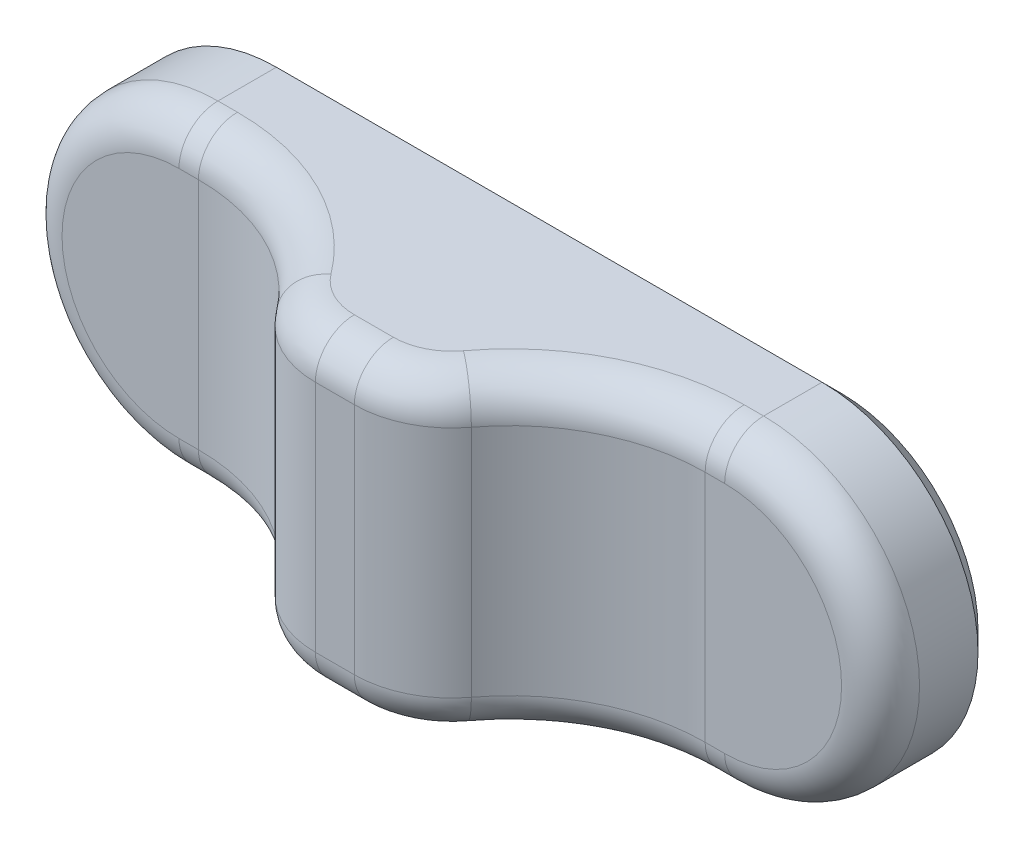
ISO-10303-21;
HEADER;
FILE_DESCRIPTION(('STEP AP214'),'2;1');
FILE_NAME('part.step','',(''),(''),'','','');
FILE_SCHEMA(('AUTOMOTIVE_DESIGN { 1 0 10303 214 1 1 1 1 }'));
ENDSEC;
DATA;
#1=APPLICATION_CONTEXT('core data for automotive mechanical design processes');
#2=APPLICATION_PROTOCOL_DEFINITION('international standard','automotive_design',2000,#1);
#3=PRODUCT_CONTEXT('',#1,'mechanical');
#4=PRODUCT('Part','Part','',(#3));
#5=PRODUCT_RELATED_PRODUCT_CATEGORY('part','',(#4));
#6=PRODUCT_DEFINITION_FORMATION('','',#4);
#7=PRODUCT_DEFINITION_CONTEXT('part definition',#1,'design');
#8=PRODUCT_DEFINITION('design','',#6,#7);
#9=PRODUCT_DEFINITION_SHAPE('','',#8);
#10=(LENGTH_UNIT() NAMED_UNIT(*) SI_UNIT(.MILLI.,.METRE.));
#11=(NAMED_UNIT(*) PLANE_ANGLE_UNIT() SI_UNIT($,.RADIAN.));
#12=(NAMED_UNIT(*) SI_UNIT($,.STERADIAN.) SOLID_ANGLE_UNIT());
#13=UNCERTAINTY_MEASURE_WITH_UNIT(LENGTH_MEASURE(1.E-05),#10,'distance_accuracy_value','');
#14=(GEOMETRIC_REPRESENTATION_CONTEXT(3) GLOBAL_UNCERTAINTY_ASSIGNED_CONTEXT((#13)) GLOBAL_UNIT_ASSIGNED_CONTEXT((#10,
#11,#12)) REPRESENTATION_CONTEXT('',''));
#15=CARTESIAN_POINT('',(0.,0.,0.));
#16=DIRECTION('',(0.,0.,1.));
#17=DIRECTION('',(1.,0.,0.));
#18=AXIS2_PLACEMENT_3D('',#15,#16,#17);
#19=CARTESIAN_POINT('',(5.47499999999995,-89.5,6.));
#20=DIRECTION('',(0.,0.,-1.));
#21=DIRECTION('',(-1.,0.,0.));
#22=AXIS2_PLACEMENT_3D('',#19,#20,#21);
#23=CYLINDRICAL_SURFACE('',#22,4.);
#24=DIRECTION('',(0.,0.,-1.));
#25=VECTOR('',#24,1.);
#26=CARTESIAN_POINT('',(5.47499999999995,-93.5,6.));
#27=LINE('',#26,#25);
#28=CARTESIAN_POINT('',(5.47499999999995,-93.5,2.));
#29=VERTEX_POINT('',#28);
#30=CARTESIAN_POINT('',(5.47499999999995,-93.5,0.500000000000004));
#31=VERTEX_POINT('',#30);
#32=EDGE_CURVE('E239',#29,#31,#27,.T.);
#33=ORIENTED_EDGE('',*,*,#32,.T.);
#34=CARTESIAN_POINT('',(5.47499999999995,-89.5,0.500000000000004));
#35=DIRECTION('',(0.,0.,1.));
#36=DIRECTION('',(1.,0.,0.));
#37=AXIS2_PLACEMENT_3D('',#34,#35,#36);
#38=CIRCLE('',#37,4.);
#39=CARTESIAN_POINT('',(5.47499999999995,-85.5,0.500000000000004));
#40=VERTEX_POINT('',#39);
#41=EDGE_CURVE('E398',#31,#40,#38,.T.);
#42=ORIENTED_EDGE('',*,*,#41,.T.);
#43=DIRECTION('',(0.,0.,-1.));
#44=VECTOR('',#43,1.);
#45=CARTESIAN_POINT('',(5.47499999999995,-85.5,6.));
#46=LINE('',#45,#44);
#47=CARTESIAN_POINT('',(5.47499999999995,-85.5,2.));
#48=VERTEX_POINT('',#47);
#49=EDGE_CURVE('E250',#48,#40,#46,.T.);
#50=ORIENTED_EDGE('',*,*,#49,.F.);
#51=CARTESIAN_POINT('',(5.47499999999995,-89.5,2.));
#52=DIRECTION('',(0.,0.,-1.));
#53=DIRECTION('',(-1.,0.,0.));
#54=AXIS2_PLACEMENT_3D('',#51,#52,#53);
#55=CIRCLE('',#54,4.);
#56=EDGE_CURVE('E319',#48,#29,#55,.T.);
#57=ORIENTED_EDGE('',*,*,#56,.T.);
#58=EDGE_LOOP('',(#33,#42,#50,#57));
#59=FACE_BOUND('',#58,.T.);
#60=ADVANCED_FACE('F40',(#59),#23,.T.);
#61=CARTESIAN_POINT('',(5.47499999999995,-85.5,6.));
#62=DIRECTION('',(0.,-1.,0.));
#63=DIRECTION('',(0.,0.,-1.));
#64=AXIS2_PLACEMENT_3D('',#61,#62,#63);
#65=PLANE('',#64);
#66=ORIENTED_EDGE('',*,*,#49,.T.);
#67=DIRECTION('',(-1.,0.,0.));
#68=VECTOR('',#67,1.);
#69=CARTESIAN_POINT('',(5.47499999999995,-85.5,0.500000000000004));
#70=LINE('',#69,#68);
#71=CARTESIAN_POINT('',(-8.52500000000005,-85.5,0.500000000000004));
#72=VERTEX_POINT('',#71);
#73=EDGE_CURVE('E337',#40,#72,#70,.T.);
#74=ORIENTED_EDGE('',*,*,#73,.T.);
#75=DIRECTION('',(0.,0.,-1.));
#76=VECTOR('',#75,1.);
#77=CARTESIAN_POINT('',(-8.52500000000005,-85.5,6.));
#78=LINE('',#77,#76);
#79=CARTESIAN_POINT('',(-8.52500000000005,-85.5,2.));
#80=VERTEX_POINT('',#79);
#81=EDGE_CURVE('E247',#80,#72,#78,.T.);
#82=ORIENTED_EDGE('',*,*,#81,.F.);
#83=DIRECTION('',(1.,0.,0.));
#84=VECTOR('',#83,1.);
#85=CARTESIAN_POINT('',(5.47499999999995,-85.5,2.));
#86=LINE('',#85,#84);
#87=CARTESIAN_POINT('',(-8.02500000000005,-85.5,2.));
#88=VERTEX_POINT('',#87);
#89=EDGE_CURVE('E321',#80,#88,#86,.T.);
#90=ORIENTED_EDGE('',*,*,#89,.T.);
#91=CARTESIAN_POINT('',(-8.02500000000005,-85.5,8.));
#92=DIRECTION('',(0.,-1.,0.));
#93=DIRECTION('',(0.,0.,-1.));
#94=AXIS2_PLACEMENT_3D('',#91,#92,#93);
#95=CIRCLE('',#94,6.);
#96=CARTESIAN_POINT('',(-3.22500000000005,-85.5,4.4));
#97=VERTEX_POINT('',#96);
#98=EDGE_CURVE('E323',#88,#97,#95,.T.);
#99=ORIENTED_EDGE('',*,*,#98,.T.);
#100=CARTESIAN_POINT('',(-2.02500000000005,-85.5,3.5));
#101=DIRECTION('',(0.,-1.,0.));
#102=DIRECTION('',(0.,0.,-1.));
#103=AXIS2_PLACEMENT_3D('',#100,#101,#102);
#104=CIRCLE('',#103,1.5);
#105=CARTESIAN_POINT('',(-2.02500000000005,-85.5,5.));
#106=VERTEX_POINT('',#105);
#107=EDGE_CURVE('E325',#97,#106,#104,.F.);
#108=ORIENTED_EDGE('',*,*,#107,.T.);
#109=DIRECTION('',(-1.,0.,0.));
#110=VECTOR('',#109,1.);
#111=CARTESIAN_POINT('',(-1.02500000000005,-85.5,5.));
#112=LINE('',#111,#110);
#113=CARTESIAN_POINT('',(-1.02500000000005,-85.5,5.));
#114=VERTEX_POINT('',#113);
#115=EDGE_CURVE('E327',#106,#114,#112,.F.);
#116=ORIENTED_EDGE('',*,*,#115,.T.);
#117=CARTESIAN_POINT('',(-1.02500000000005,-85.5,3.5));
#118=DIRECTION('',(0.,-1.,0.));
#119=DIRECTION('',(0.,0.,-1.));
#120=AXIS2_PLACEMENT_3D('',#117,#118,#119);
#121=CIRCLE('',#120,1.5);
#122=CARTESIAN_POINT('',(0.174999999999951,-85.5,4.4));
#123=VERTEX_POINT('',#122);
#124=EDGE_CURVE('E329',#114,#123,#121,.F.);
#125=ORIENTED_EDGE('',*,*,#124,.T.);
#126=CARTESIAN_POINT('',(4.97499999999995,-85.5,8.));
#127=DIRECTION('',(0.,-1.,0.));
#128=DIRECTION('',(0.,0.,-1.));
#129=AXIS2_PLACEMENT_3D('',#126,#127,#128);
#130=CIRCLE('',#129,6.);
#131=CARTESIAN_POINT('',(4.97499999999995,-85.5,2.));
#132=VERTEX_POINT('',#131);
#133=EDGE_CURVE('E331',#123,#132,#130,.T.);
#134=ORIENTED_EDGE('',*,*,#133,.T.);
#135=DIRECTION('',(1.,0.,0.));
#136=VECTOR('',#135,1.);
#137=CARTESIAN_POINT('',(5.47499999999995,-85.5,2.));
#138=LINE('',#137,#136);
#139=EDGE_CURVE('E333',#132,#48,#138,.T.);
#140=ORIENTED_EDGE('',*,*,#139,.T.);
#141=EDGE_LOOP('',(#66,#74,#82,#90,#99,#108,#116,#125,#134,#140));
#142=FACE_BOUND('',#141,.T.);
#143=ADVANCED_FACE('F468',(#142),#65,.F.);
#144=CARTESIAN_POINT('',(-8.52500000000005,-89.5,6.));
#145=DIRECTION('',(0.,0.,-1.));
#146=DIRECTION('',(-1.,0.,0.));
#147=AXIS2_PLACEMENT_3D('',#144,#145,#146);
#148=CYLINDRICAL_SURFACE('',#147,4.);
#149=ORIENTED_EDGE('',*,*,#81,.T.);
#150=CARTESIAN_POINT('',(-8.52500000000005,-89.5,0.500000000000004));
#151=DIRECTION('',(0.,0.,1.));
#152=DIRECTION('',(1.,0.,0.));
#153=AXIS2_PLACEMENT_3D('',#150,#151,#152);
#154=CIRCLE('',#153,4.);
#155=CARTESIAN_POINT('',(-8.52500000000005,-93.5,0.500000000000004));
#156=VERTEX_POINT('',#155);
#157=EDGE_CURVE('E396',#72,#156,#154,.T.);
#158=ORIENTED_EDGE('',*,*,#157,.T.);
#159=DIRECTION('',(0.,0.,-1.));
#160=VECTOR('',#159,1.);
#161=CARTESIAN_POINT('',(-8.52500000000005,-93.5,6.));
#162=LINE('',#161,#160);
#163=CARTESIAN_POINT('',(-8.52500000000005,-93.5,2.));
#164=VERTEX_POINT('',#163);
#165=EDGE_CURVE('E244',#164,#156,#162,.T.);
#166=ORIENTED_EDGE('',*,*,#165,.F.);
#167=CARTESIAN_POINT('',(-8.52500000000005,-89.5,2.));
#168=DIRECTION('',(0.,0.,-1.));
#169=DIRECTION('',(-1.,0.,0.));
#170=AXIS2_PLACEMENT_3D('',#167,#168,#169);
#171=CIRCLE('',#170,4.);
#172=EDGE_CURVE('E335',#164,#80,#171,.T.);
#173=ORIENTED_EDGE('',*,*,#172,.T.);
#174=EDGE_LOOP('',(#149,#158,#166,#173));
#175=FACE_BOUND('',#174,.T.);
#176=ADVANCED_FACE('F474',(#175),#148,.T.);
#177=CARTESIAN_POINT('',(5.47499999999995,-93.5,6.));
#178=DIRECTION('',(0.,1.,0.));
#179=DIRECTION('',(0.,0.,1.));
#180=AXIS2_PLACEMENT_3D('',#177,#178,#179);
#181=PLANE('',#180);
#182=ORIENTED_EDGE('',*,*,#165,.T.);
#183=DIRECTION('',(1.,0.,0.));
#184=VECTOR('',#183,1.);
#185=CARTESIAN_POINT('',(5.47499999999995,-93.5,0.500000000000004));
#186=LINE('',#185,#184);
#187=EDGE_CURVE('E400',#156,#31,#186,.T.);
#188=ORIENTED_EDGE('',*,*,#187,.T.);
#189=ORIENTED_EDGE('',*,*,#32,.F.);
#190=DIRECTION('',(1.,0.,0.));
#191=VECTOR('',#190,1.);
#192=CARTESIAN_POINT('',(5.47499999999995,-93.5,2.));
#193=LINE('',#192,#191);
#194=CARTESIAN_POINT('',(4.97499999999995,-93.5,2.));
#195=VERTEX_POINT('',#194);
#196=EDGE_CURVE('E278',#29,#195,#193,.F.);
#197=ORIENTED_EDGE('',*,*,#196,.T.);
#198=CARTESIAN_POINT('',(4.97499999999995,-93.5,8.));
#199=DIRECTION('',(0.,1.,0.));
#200=DIRECTION('',(0.,0.,1.));
#201=AXIS2_PLACEMENT_3D('',#198,#199,#200);
#202=CIRCLE('',#201,6.);
#203=CARTESIAN_POINT('',(0.174999999999951,-93.5,4.4));
#204=VERTEX_POINT('',#203);
#205=EDGE_CURVE('E280',#195,#204,#202,.T.);
#206=ORIENTED_EDGE('',*,*,#205,.T.);
#207=CARTESIAN_POINT('',(-1.02500000000005,-93.5,3.5));
#208=DIRECTION('',(0.,1.,0.));
#209=DIRECTION('',(0.,0.,1.));
#210=AXIS2_PLACEMENT_3D('',#207,#208,#209);
#211=CIRCLE('',#210,1.5);
#212=CARTESIAN_POINT('',(-1.02500000000005,-93.5,5.));
#213=VERTEX_POINT('',#212);
#214=EDGE_CURVE('E282',#204,#213,#211,.F.);
#215=ORIENTED_EDGE('',*,*,#214,.T.);
#216=DIRECTION('',(1.,0.,0.));
#217=VECTOR('',#216,1.);
#218=CARTESIAN_POINT('',(-2.02500000000005,-93.5,5.));
#219=LINE('',#218,#217);
#220=CARTESIAN_POINT('',(-2.02500000000005,-93.5,5.));
#221=VERTEX_POINT('',#220);
#222=EDGE_CURVE('E284',#213,#221,#219,.F.);
#223=ORIENTED_EDGE('',*,*,#222,.T.);
#224=CARTESIAN_POINT('',(-2.02500000000005,-93.5,3.5));
#225=DIRECTION('',(0.,1.,0.));
#226=DIRECTION('',(0.,0.,1.));
#227=AXIS2_PLACEMENT_3D('',#224,#225,#226);
#228=CIRCLE('',#227,1.5);
#229=CARTESIAN_POINT('',(-3.22500000000005,-93.5,4.4));
#230=VERTEX_POINT('',#229);
#231=EDGE_CURVE('E286',#221,#230,#228,.F.);
#232=ORIENTED_EDGE('',*,*,#231,.T.);
#233=CARTESIAN_POINT('',(-8.02500000000005,-93.5,8.));
#234=DIRECTION('',(0.,1.,0.));
#235=DIRECTION('',(0.,0.,1.));
#236=AXIS2_PLACEMENT_3D('',#233,#234,#235);
#237=CIRCLE('',#236,6.);
#238=CARTESIAN_POINT('',(-8.02500000000005,-93.5,2.));
#239=VERTEX_POINT('',#238);
#240=EDGE_CURVE('E288',#230,#239,#237,.T.);
#241=ORIENTED_EDGE('',*,*,#240,.T.);
#242=DIRECTION('',(1.,0.,0.));
#243=VECTOR('',#242,1.);
#244=CARTESIAN_POINT('',(5.47499999999995,-93.5,2.));
#245=LINE('',#244,#243);
#246=EDGE_CURVE('E290',#239,#164,#245,.F.);
#247=ORIENTED_EDGE('',*,*,#246,.T.);
#248=EDGE_LOOP('',(#182,#188,#189,#197,#206,#215,#223,#232,#241,#247));
#249=FACE_BOUND('',#248,.T.);
#250=ADVANCED_FACE('F735',(#249),#181,.F.);
#251=CARTESIAN_POINT('',(5.47499999999995,-89.5,6.));
#252=DIRECTION('',(0.,0.,1.));
#253=DIRECTION('',(1.,0.,0.));
#254=AXIS2_PLACEMENT_3D('',#251,#252,#253);
#255=PLANE('',#254);
#256=DIRECTION('',(0.,-1.,0.));
#257=VECTOR('',#256,1.);
#258=CARTESIAN_POINT('',(-2.02500000000005,-93.5,6.));
#259=LINE('',#258,#257);
#260=CARTESIAN_POINT('',(-2.02500000000005,-86.5,6.));
#261=VERTEX_POINT('',#260);
#262=CARTESIAN_POINT('',(-2.02500000000005,-92.5,6.));
#263=VERTEX_POINT('',#262);
#264=EDGE_CURVE('E253',#261,#263,#259,.T.);
#265=ORIENTED_EDGE('',*,*,#264,.T.);
#266=DIRECTION('',(1.,0.,0.));
#267=VECTOR('',#266,1.);
#268=CARTESIAN_POINT('',(-1.02500000000005,-92.5,6.));
#269=LINE('',#268,#267);
#270=CARTESIAN_POINT('',(-1.02500000000005,-92.5,6.));
#271=VERTEX_POINT('',#270);
#272=EDGE_CURVE('E303',#263,#271,#269,.T.);
#273=ORIENTED_EDGE('',*,*,#272,.T.);
#274=DIRECTION('',(0.,-1.,0.));
#275=VECTOR('',#274,1.);
#276=CARTESIAN_POINT('',(-1.02500000000005,-85.5,6.));
#277=LINE('',#276,#275);
#278=CARTESIAN_POINT('',(-1.02500000000005,-86.5,6.));
#279=VERTEX_POINT('',#278);
#280=EDGE_CURVE('E256',#271,#279,#277,.F.);
#281=ORIENTED_EDGE('',*,*,#280,.T.);
#282=DIRECTION('',(-1.,0.,0.));
#283=VECTOR('',#282,1.);
#284=CARTESIAN_POINT('',(-2.02500000000005,-86.5,6.));
#285=LINE('',#284,#283);
#286=EDGE_CURVE('E301',#279,#261,#285,.T.);
#287=ORIENTED_EDGE('',*,*,#286,.T.);
#288=EDGE_LOOP('',(#265,#273,#281,#287));
#289=FACE_BOUND('',#288,.T.);
#290=ADVANCED_FACE('F731',(#289),#255,.T.);
#291=CARTESIAN_POINT('',(5.47499999999995,-89.5,0.));
#292=DIRECTION('',(0.,0.,1.));
#293=DIRECTION('',(1.,0.,0.));
#294=AXIS2_PLACEMENT_3D('',#291,#292,#293);
#295=PLANE('',#294);
#296=CARTESIAN_POINT('',(-8.52500000000005,-89.5,0.));
#297=DIRECTION('',(0.,0.,1.));
#298=DIRECTION('',(1.,0.,0.));
#299=AXIS2_PLACEMENT_3D('',#296,#297,#298);
#300=CIRCLE('',#299,3.5);
#301=CARTESIAN_POINT('',(-8.52500000000005,-93.,0.));
#302=VERTEX_POINT('',#301);
#303=CARTESIAN_POINT('',(-8.52500000000005,-86.,0.));
#304=VERTEX_POINT('',#303);
#305=EDGE_CURVE('E391',#302,#304,#300,.F.);
#306=ORIENTED_EDGE('',*,*,#305,.T.);
#307=DIRECTION('',(1.,0.,0.));
#308=VECTOR('',#307,1.);
#309=CARTESIAN_POINT('',(5.47499999999995,-86.,0.));
#310=LINE('',#309,#308);
#311=CARTESIAN_POINT('',(5.47499999999995,-86.,0.));
#312=VERTEX_POINT('',#311);
#313=EDGE_CURVE('E393',#304,#312,#310,.T.);
#314=ORIENTED_EDGE('',*,*,#313,.T.);
#315=CARTESIAN_POINT('',(5.47499999999995,-89.5,0.));
#316=DIRECTION('',(0.,0.,1.));
#317=DIRECTION('',(1.,0.,0.));
#318=AXIS2_PLACEMENT_3D('',#315,#316,#317);
#319=CIRCLE('',#318,3.5);
#320=CARTESIAN_POINT('',(5.47499999999995,-93.,0.));
#321=VERTEX_POINT('',#320);
#322=EDGE_CURVE('E389',#312,#321,#319,.F.);
#323=ORIENTED_EDGE('',*,*,#322,.T.);
#324=DIRECTION('',(-1.,0.,0.));
#325=VECTOR('',#324,1.);
#326=CARTESIAN_POINT('',(5.47499999999995,-93.,0.));
#327=LINE('',#326,#325);
#328=EDGE_CURVE('E387',#321,#302,#327,.T.);
#329=ORIENTED_EDGE('',*,*,#328,.T.);
#330=EDGE_LOOP('',(#306,#314,#323,#329));
#331=FACE_BOUND('',#330,.T.);
#332=DIRECTION('',(-1.,0.,0.));
#333=VECTOR('',#332,1.);
#334=CARTESIAN_POINT('',(0.0749999999999479,-91.1,0.));
#335=LINE('',#334,#333);
#336=CARTESIAN_POINT('',(0.0749999999999484,-91.1,0.));
#337=VERTEX_POINT('',#336);
#338=CARTESIAN_POINT('',(-3.12500000000005,-91.1,0.));
#339=VERTEX_POINT('',#338);
#340=EDGE_CURVE('E223',#337,#339,#335,.T.);
#341=ORIENTED_EDGE('',*,*,#340,.F.);
#342=DIRECTION('',(0.,-1.,0.));
#343=VECTOR('',#342,1.);
#344=CARTESIAN_POINT('',(0.0749999999999513,-87.9,0.));
#345=LINE('',#344,#343);
#346=CARTESIAN_POINT('',(0.0749999999999513,-87.9,0.));
#347=VERTEX_POINT('',#346);
#348=EDGE_CURVE('E228',#347,#337,#345,.T.);
#349=ORIENTED_EDGE('',*,*,#348,.F.);
#350=DIRECTION('',(1.,0.,0.));
#351=VECTOR('',#350,1.);
#352=CARTESIAN_POINT('',(0.0749999999999513,-87.9,0.));
#353=LINE('',#352,#351);
#354=CARTESIAN_POINT('',(-3.12500000000005,-87.9,0.));
#355=VERTEX_POINT('',#354);
#356=EDGE_CURVE('E232',#355,#347,#353,.T.);
#357=ORIENTED_EDGE('',*,*,#356,.F.);
#358=DIRECTION('',(0.,1.,0.));
#359=VECTOR('',#358,1.);
#360=CARTESIAN_POINT('',(-3.12500000000005,-87.9,0.));
#361=LINE('',#360,#359);
#362=EDGE_CURVE('E217',#339,#355,#361,.T.);
#363=ORIENTED_EDGE('',*,*,#362,.F.);
#364=EDGE_LOOP('',(#341,#349,#357,#363));
#365=FACE_BOUND('',#364,.T.);
#366=ADVANCED_FACE('F230',(#331,#365),#295,.F.);
#367=CARTESIAN_POINT('',(9.47499999999996,-85.5,3.));
#368=DIRECTION('',(0.,0.,-1.));
#369=DIRECTION('',(-1.,0.,0.));
#370=AXIS2_PLACEMENT_3D('',#367,#368,#369);
#371=PLANE('',#370);
#372=DIRECTION('',(0.,1.,0.));
#373=VECTOR('',#372,1.);
#374=CARTESIAN_POINT('',(4.97499999999995,-85.5,3.));
#375=LINE('',#374,#373);
#376=CARTESIAN_POINT('',(4.97499999999995,-86.5,3.));
#377=VERTEX_POINT('',#376);
#378=CARTESIAN_POINT('',(4.97499999999995,-92.5,3.));
#379=VERTEX_POINT('',#378);
#380=EDGE_CURVE('E259',#377,#379,#375,.F.);
#381=ORIENTED_EDGE('',*,*,#380,.T.);
#382=DIRECTION('',(1.,0.,0.));
#383=VECTOR('',#382,1.);
#384=CARTESIAN_POINT('',(9.47499999999996,-92.5,3.));
#385=LINE('',#384,#383);
#386=CARTESIAN_POINT('',(5.47499999999995,-92.5,3.));
#387=VERTEX_POINT('',#386);
#388=EDGE_CURVE('E317',#379,#387,#385,.T.);
#389=ORIENTED_EDGE('',*,*,#388,.T.);
#390=CARTESIAN_POINT('',(5.47499999999995,-89.5,3.));
#391=DIRECTION('',(0.,0.,-1.));
#392=DIRECTION('',(-1.,0.,0.));
#393=AXIS2_PLACEMENT_3D('',#390,#391,#392);
#394=CIRCLE('',#393,3.);
#395=CARTESIAN_POINT('',(5.47499999999995,-86.5,3.));
#396=VERTEX_POINT('',#395);
#397=EDGE_CURVE('E315',#387,#396,#394,.F.);
#398=ORIENTED_EDGE('',*,*,#397,.T.);
#399=DIRECTION('',(1.,0.,0.));
#400=VECTOR('',#399,1.);
#401=CARTESIAN_POINT('',(9.47499999999996,-86.5,3.));
#402=LINE('',#401,#400);
#403=EDGE_CURVE('E313',#396,#377,#402,.F.);
#404=ORIENTED_EDGE('',*,*,#403,.T.);
#405=EDGE_LOOP('',(#381,#389,#398,#404));
#406=FACE_BOUND('',#405,.T.);
#407=ADVANCED_FACE('F710',(#406),#371,.F.);
#408=CARTESIAN_POINT('',(-12.5250000000001,-85.5,3.));
#409=DIRECTION('',(0.,0.,-1.));
#410=DIRECTION('',(-1.,0.,0.));
#411=AXIS2_PLACEMENT_3D('',#408,#409,#410);
#412=PLANE('',#411);
#413=CARTESIAN_POINT('',(-8.52500000000005,-89.5,3.));
#414=DIRECTION('',(0.,0.,-1.));
#415=DIRECTION('',(-1.,0.,0.));
#416=AXIS2_PLACEMENT_3D('',#413,#414,#415);
#417=CIRCLE('',#416,3.);
#418=CARTESIAN_POINT('',(-8.52500000000005,-86.5,3.));
#419=VERTEX_POINT('',#418);
#420=CARTESIAN_POINT('',(-8.52500000000005,-92.5,3.));
#421=VERTEX_POINT('',#420);
#422=EDGE_CURVE('E271',#419,#421,#417,.F.);
#423=ORIENTED_EDGE('',*,*,#422,.T.);
#424=DIRECTION('',(1.,0.,0.));
#425=VECTOR('',#424,1.);
#426=CARTESIAN_POINT('',(-12.5250000000001,-92.5,3.));
#427=LINE('',#426,#425);
#428=CARTESIAN_POINT('',(-8.02500000000005,-92.5,3.));
#429=VERTEX_POINT('',#428);
#430=EDGE_CURVE('E275',#421,#429,#427,.T.);
#431=ORIENTED_EDGE('',*,*,#430,.T.);
#432=DIRECTION('',(0.,1.,0.));
#433=VECTOR('',#432,1.);
#434=CARTESIAN_POINT('',(-8.02500000000005,-85.5,3.));
#435=LINE('',#434,#433);
#436=CARTESIAN_POINT('',(-8.02500000000005,-86.5,3.));
#437=VERTEX_POINT('',#436);
#438=EDGE_CURVE('E268',#429,#437,#435,.T.);
#439=ORIENTED_EDGE('',*,*,#438,.T.);
#440=DIRECTION('',(1.,0.,0.));
#441=VECTOR('',#440,1.);
#442=CARTESIAN_POINT('',(-12.5250000000001,-86.5,3.));
#443=LINE('',#442,#441);
#444=EDGE_CURVE('E273',#437,#419,#443,.F.);
#445=ORIENTED_EDGE('',*,*,#444,.T.);
#446=EDGE_LOOP('',(#423,#431,#439,#445));
#447=FACE_BOUND('',#446,.T.);
#448=ADVANCED_FACE('F705',(#447),#412,.F.);
#449=CARTESIAN_POINT('',(0.0749999999999513,-87.9,5.));
#450=DIRECTION('',(1.,0.,0.));
#451=DIRECTION('',(0.,1.,0.));
#452=AXIS2_PLACEMENT_3D('',#449,#450,#451);
#453=PLANE('',#452);
#454=DIRECTION('',(0.,0.,-1.));
#455=VECTOR('',#454,1.);
#456=CARTESIAN_POINT('',(0.0749999999999479,-91.1,5.));
#457=LINE('',#456,#455);
#458=CARTESIAN_POINT('',(0.0749999999999479,-91.1,4.));
#459=VERTEX_POINT('',#458);
#460=EDGE_CURVE('E220',#459,#337,#457,.T.);
#461=ORIENTED_EDGE('',*,*,#460,.F.);
#462=DIRECTION('',(0.,1.,0.));
#463=VECTOR('',#462,1.);
#464=CARTESIAN_POINT('',(0.0749999999999513,-87.9,4.));
#465=LINE('',#464,#463);
#466=CARTESIAN_POINT('',(0.0749999999999513,-87.9,4.));
#467=VERTEX_POINT('',#466);
#468=EDGE_CURVE('E11',#459,#467,#465,.T.);
#469=ORIENTED_EDGE('',*,*,#468,.T.);
#470=DIRECTION('',(0.,0.,-1.));
#471=VECTOR('',#470,1.);
#472=CARTESIAN_POINT('',(0.0749999999999513,-87.9,5.));
#473=LINE('',#472,#471);
#474=EDGE_CURVE('E237',#467,#347,#473,.T.);
#475=ORIENTED_EDGE('',*,*,#474,.T.);
#476=ORIENTED_EDGE('',*,*,#348,.T.);
#477=EDGE_LOOP('',(#461,#469,#475,#476));
#478=FACE_BOUND('',#477,.T.);
#479=ADVANCED_FACE('F446',(#478),#453,.F.);
#480=CARTESIAN_POINT('',(0.0749999999999513,-87.9,5.));
#481=DIRECTION('',(0.,1.,0.));
#482=DIRECTION('',(0.,0.,1.));
#483=AXIS2_PLACEMENT_3D('',#480,#481,#482);
#484=PLANE('',#483);
#485=ORIENTED_EDGE('',*,*,#474,.F.);
#486=DIRECTION('',(-1.,0.,0.));
#487=VECTOR('',#486,1.);
#488=CARTESIAN_POINT('',(0.0749999999999513,-87.9,4.));
#489=LINE('',#488,#487);
#490=CARTESIAN_POINT('',(-3.12500000000005,-87.9,4.));
#491=VERTEX_POINT('',#490);
#492=EDGE_CURVE('E420',#467,#491,#489,.T.);
#493=ORIENTED_EDGE('',*,*,#492,.T.);
#494=DIRECTION('',(0.,0.,-1.));
#495=VECTOR('',#494,1.);
#496=CARTESIAN_POINT('',(-3.12500000000005,-87.9,5.));
#497=LINE('',#496,#495);
#498=EDGE_CURVE('E219',#491,#355,#497,.T.);
#499=ORIENTED_EDGE('',*,*,#498,.T.);
#500=ORIENTED_EDGE('',*,*,#356,.T.);
#501=EDGE_LOOP('',(#485,#493,#499,#500));
#502=FACE_BOUND('',#501,.T.);
#503=ADVANCED_FACE('F449',(#502),#484,.F.);
#504=CARTESIAN_POINT('',(-3.12500000000005,-87.9,5.));
#505=DIRECTION('',(-1.,0.,0.));
#506=DIRECTION('',(0.,0.,1.));
#507=AXIS2_PLACEMENT_3D('',#504,#505,#506);
#508=PLANE('',#507);
#509=ORIENTED_EDGE('',*,*,#498,.F.);
#510=DIRECTION('',(0.,-1.,0.));
#511=VECTOR('',#510,1.);
#512=CARTESIAN_POINT('',(-3.12500000000005,-87.9,4.));
#513=LINE('',#512,#511);
#514=CARTESIAN_POINT('',(-3.12500000000005,-91.1,4.));
#515=VERTEX_POINT('',#514);
#516=EDGE_CURVE('E65',#491,#515,#513,.T.);
#517=ORIENTED_EDGE('',*,*,#516,.T.);
#518=DIRECTION('',(0.,0.,-1.));
#519=VECTOR('',#518,1.);
#520=CARTESIAN_POINT('',(-3.12500000000005,-91.1,5.));
#521=LINE('',#520,#519);
#522=EDGE_CURVE('E213',#515,#339,#521,.T.);
#523=ORIENTED_EDGE('',*,*,#522,.T.);
#524=ORIENTED_EDGE('',*,*,#362,.T.);
#525=EDGE_LOOP('',(#509,#517,#523,#524));
#526=FACE_BOUND('',#525,.T.);
#527=ADVANCED_FACE('F215',(#526),#508,.F.);
#528=CARTESIAN_POINT('',(0.0749999999999479,-91.1,5.));
#529=DIRECTION('',(0.,-1.,0.));
#530=DIRECTION('',(0.,0.,-1.));
#531=AXIS2_PLACEMENT_3D('',#528,#529,#530);
#532=PLANE('',#531);
#533=ORIENTED_EDGE('',*,*,#522,.F.);
#534=DIRECTION('',(1.,0.,0.));
#535=VECTOR('',#534,1.);
#536=CARTESIAN_POINT('',(0.0749999999999479,-91.1,4.));
#537=LINE('',#536,#535);
#538=EDGE_CURVE('E50',#515,#459,#537,.T.);
#539=ORIENTED_EDGE('',*,*,#538,.T.);
#540=ORIENTED_EDGE('',*,*,#460,.T.);
#541=ORIENTED_EDGE('',*,*,#340,.T.);
#542=EDGE_LOOP('',(#533,#539,#540,#541));
#543=FACE_BOUND('',#542,.T.);
#544=ADVANCED_FACE('F224',(#543),#532,.F.);
#545=CARTESIAN_POINT('',(0.,0.,5.));
#546=DIRECTION('',(0.,0.,-1.));
#547=DIRECTION('',(-1.,0.,0.));
#548=AXIS2_PLACEMENT_3D('',#545,#546,#547);
#549=PLANE('',#548);
#550=DIRECTION('',(0.,1.,0.));
#551=VECTOR('',#550,1.);
#552=CARTESIAN_POINT('',(-2.12500000000004,0.,5.));
#553=LINE('',#552,#551);
#554=CARTESIAN_POINT('',(-2.12500000000004,-90.1,5.));
#555=VERTEX_POINT('',#554);
#556=CARTESIAN_POINT('',(-2.12500000000004,-88.9,5.));
#557=VERTEX_POINT('',#556);
#558=EDGE_CURVE('E415',#555,#557,#553,.T.);
#559=ORIENTED_EDGE('',*,*,#558,.T.);
#560=DIRECTION('',(1.,0.,0.));
#561=VECTOR('',#560,1.);
#562=CARTESIAN_POINT('',(0.,-88.9,5.));
#563=LINE('',#562,#561);
#564=CARTESIAN_POINT('',(-0.925000000000058,-88.9,5.));
#565=VERTEX_POINT('',#564);
#566=EDGE_CURVE('E417',#557,#565,#563,.T.);
#567=ORIENTED_EDGE('',*,*,#566,.T.);
#568=DIRECTION('',(0.,-1.,0.));
#569=VECTOR('',#568,1.);
#570=CARTESIAN_POINT('',(-0.924999999999964,0.,5.));
#571=LINE('',#570,#569);
#572=CARTESIAN_POINT('',(-0.925000000000059,-90.1,5.));
#573=VERTEX_POINT('',#572);
#574=EDGE_CURVE('E402',#565,#573,#571,.T.);
#575=ORIENTED_EDGE('',*,*,#574,.T.);
#576=DIRECTION('',(-1.,0.,0.));
#577=VECTOR('',#576,1.);
#578=CARTESIAN_POINT('',(0.,-90.1,5.));
#579=LINE('',#578,#577);
#580=EDGE_CURVE('E413',#573,#555,#579,.T.);
#581=ORIENTED_EDGE('',*,*,#580,.T.);
#582=EDGE_LOOP('',(#559,#567,#575,#581));
#583=FACE_BOUND('',#582,.T.);
#584=ADVANCED_FACE('F454',(#583),#549,.T.);
#585=CARTESIAN_POINT('',(-1.02500000000005,-85.5,3.5));
#586=DIRECTION('',(0.,1.,0.));
#587=DIRECTION('',(0.,0.,1.));
#588=AXIS2_PLACEMENT_3D('',#585,#586,#587);
#589=CYLINDRICAL_SURFACE('',#588,2.5);
#590=ORIENTED_EDGE('',*,*,#280,.F.);
#591=CARTESIAN_POINT('',(-1.02500000000005,-92.5,3.5));
#592=DIRECTION('',(0.,1.,0.));
#593=DIRECTION('',(0.,0.,1.));
#594=AXIS2_PLACEMENT_3D('',#591,#592,#593);
#595=CIRCLE('',#594,2.5);
#596=CARTESIAN_POINT('',(0.974999999999951,-92.5,5.));
#597=VERTEX_POINT('',#596);
#598=EDGE_CURVE('E307',#271,#597,#595,.T.);
#599=ORIENTED_EDGE('',*,*,#598,.T.);
#600=DIRECTION('',(0.,1.,0.));
#601=VECTOR('',#600,1.);
#602=CARTESIAN_POINT('',(0.974999999999951,-85.5,5.));
#603=LINE('',#602,#601);
#604=CARTESIAN_POINT('',(0.974999999999951,-86.5,5.));
#605=VERTEX_POINT('',#604);
#606=EDGE_CURVE('E262',#597,#605,#603,.T.);
#607=ORIENTED_EDGE('',*,*,#606,.T.);
#608=CARTESIAN_POINT('',(-1.02500000000005,-86.5,3.5));
#609=DIRECTION('',(0.,-1.,0.));
#610=DIRECTION('',(0.,0.,-1.));
#611=AXIS2_PLACEMENT_3D('',#608,#609,#610);
#612=CIRCLE('',#611,2.5);
#613=EDGE_CURVE('E305',#605,#279,#612,.T.);
#614=ORIENTED_EDGE('',*,*,#613,.T.);
#615=EDGE_LOOP('',(#590,#599,#607,#614));
#616=FACE_BOUND('',#615,.T.);
#617=ADVANCED_FACE('F456',(#616),#589,.T.);
#618=CARTESIAN_POINT('',(-2.02500000000005,-89.5,3.5));
#619=DIRECTION('',(0.,1.,0.));
#620=DIRECTION('',(0.,0.,1.));
#621=AXIS2_PLACEMENT_3D('',#618,#619,#620);
#622=CYLINDRICAL_SURFACE('',#621,2.5);
#623=DIRECTION('',(0.,1.,0.));
#624=VECTOR('',#623,1.);
#625=CARTESIAN_POINT('',(-4.02500000000005,-89.5,5.));
#626=LINE('',#625,#624);
#627=CARTESIAN_POINT('',(-4.02500000000005,-86.5,5.));
#628=VERTEX_POINT('',#627);
#629=CARTESIAN_POINT('',(-4.02500000000005,-92.5,5.));
#630=VERTEX_POINT('',#629);
#631=EDGE_CURVE('E265',#628,#630,#626,.F.);
#632=ORIENTED_EDGE('',*,*,#631,.T.);
#633=CARTESIAN_POINT('',(-2.02500000000005,-92.5,3.5));
#634=DIRECTION('',(0.,1.,0.));
#635=DIRECTION('',(0.,0.,1.));
#636=AXIS2_PLACEMENT_3D('',#633,#634,#635);
#637=CIRCLE('',#636,2.5);
#638=EDGE_CURVE('E299',#630,#263,#637,.T.);
#639=ORIENTED_EDGE('',*,*,#638,.T.);
#640=ORIENTED_EDGE('',*,*,#264,.F.);
#641=CARTESIAN_POINT('',(-2.02500000000005,-86.5,3.5));
#642=DIRECTION('',(0.,-1.,0.));
#643=DIRECTION('',(0.,0.,-1.));
#644=AXIS2_PLACEMENT_3D('',#641,#642,#643);
#645=CIRCLE('',#644,2.5);
#646=EDGE_CURVE('E297',#261,#628,#645,.T.);
#647=ORIENTED_EDGE('',*,*,#646,.T.);
#648=EDGE_LOOP('',(#632,#639,#640,#647));
#649=FACE_BOUND('',#648,.T.);
#650=ADVANCED_FACE('F462',(#649),#622,.T.);
#651=CARTESIAN_POINT('',(4.97499999999995,-85.5,8.));
#652=DIRECTION('',(0.,1.,0.));
#653=DIRECTION('',(0.,0.,1.));
#654=AXIS2_PLACEMENT_3D('',#651,#652,#653);
#655=CYLINDRICAL_SURFACE('',#654,5.);
#656=ORIENTED_EDGE('',*,*,#606,.F.);
#657=CARTESIAN_POINT('',(4.97499999999995,-92.5,8.));
#658=DIRECTION('',(0.,1.,0.));
#659=DIRECTION('',(0.,0.,1.));
#660=AXIS2_PLACEMENT_3D('',#657,#658,#659);
#661=CIRCLE('',#660,5.);
#662=EDGE_CURVE('E311',#597,#379,#661,.F.);
#663=ORIENTED_EDGE('',*,*,#662,.T.);
#664=ORIENTED_EDGE('',*,*,#380,.F.);
#665=CARTESIAN_POINT('',(4.97499999999995,-86.5,8.));
#666=DIRECTION('',(0.,-1.,0.));
#667=DIRECTION('',(0.,0.,-1.));
#668=AXIS2_PLACEMENT_3D('',#665,#666,#667);
#669=CIRCLE('',#668,5.);
#670=EDGE_CURVE('E309',#377,#605,#669,.F.);
#671=ORIENTED_EDGE('',*,*,#670,.T.);
#672=EDGE_LOOP('',(#656,#663,#664,#671));
#673=FACE_BOUND('',#672,.T.);
#674=ADVANCED_FACE('F481',(#673),#655,.F.);
#675=CARTESIAN_POINT('',(-8.02500000000005,-89.5,8.));
#676=DIRECTION('',(0.,1.,0.));
#677=DIRECTION('',(0.,0.,1.));
#678=AXIS2_PLACEMENT_3D('',#675,#676,#677);
#679=CYLINDRICAL_SURFACE('',#678,5.);
#680=ORIENTED_EDGE('',*,*,#438,.F.);
#681=CARTESIAN_POINT('',(-8.02500000000005,-92.5,8.));
#682=DIRECTION('',(0.,1.,0.));
#683=DIRECTION('',(0.,0.,1.));
#684=AXIS2_PLACEMENT_3D('',#681,#682,#683);
#685=CIRCLE('',#684,5.);
#686=EDGE_CURVE('E295',#429,#630,#685,.F.);
#687=ORIENTED_EDGE('',*,*,#686,.T.);
#688=ORIENTED_EDGE('',*,*,#631,.F.);
#689=CARTESIAN_POINT('',(-8.02500000000005,-86.5,8.));
#690=DIRECTION('',(0.,-1.,0.));
#691=DIRECTION('',(0.,0.,-1.));
#692=AXIS2_PLACEMENT_3D('',#689,#690,#691);
#693=CIRCLE('',#692,5.);
#694=EDGE_CURVE('E293',#628,#437,#693,.F.);
#695=ORIENTED_EDGE('',*,*,#694,.T.);
#696=EDGE_LOOP('',(#680,#687,#688,#695));
#697=FACE_BOUND('',#696,.T.);
#698=ADVANCED_FACE('F485',(#697),#679,.F.);
#699=CARTESIAN_POINT('',(5.47499999999995,-86.5,2.));
#700=DIRECTION('',(1.,0.,0.));
#701=DIRECTION('',(0.,0.,-1.));
#702=AXIS2_PLACEMENT_3D('',#699,#700,#701);
#703=CYLINDRICAL_SURFACE('',#702,1.);
#704=CARTESIAN_POINT('',(5.47499999999995,-86.5,2.));
#705=DIRECTION('',(1.,0.,0.));
#706=DIRECTION('',(0.,0.,-1.));
#707=AXIS2_PLACEMENT_3D('',#704,#705,#706);
#708=CIRCLE('',#707,1.);
#709=EDGE_CURVE('E379',#48,#396,#708,.T.);
#710=ORIENTED_EDGE('',*,*,#709,.F.);
#711=ORIENTED_EDGE('',*,*,#139,.F.);
#712=CARTESIAN_POINT('',(4.97499999999995,-86.5,2.));
#713=DIRECTION('',(-1.,0.,0.));
#714=DIRECTION('',(0.,0.,1.));
#715=AXIS2_PLACEMENT_3D('',#712,#713,#714);
#716=CIRCLE('',#715,1.);
#717=EDGE_CURVE('E382',#377,#132,#716,.T.);
#718=ORIENTED_EDGE('',*,*,#717,.F.);
#719=ORIENTED_EDGE('',*,*,#403,.F.);
#720=EDGE_LOOP('',(#710,#711,#718,#719));
#721=FACE_BOUND('',#720,.T.);
#722=ADVANCED_FACE('F489',(#721),#703,.T.);
#723=CARTESIAN_POINT('',(4.97499999999995,-86.5,8.));
#724=DIRECTION('',(0.,-1.,0.));
#725=DIRECTION('',(0.,0.,-1.));
#726=AXIS2_PLACEMENT_3D('',#723,#724,#725);
#727=TOROIDAL_SURFACE('',#726,6.,1.);
#728=ORIENTED_EDGE('',*,*,#717,.T.);
#729=ORIENTED_EDGE('',*,*,#133,.F.);
#730=CARTESIAN_POINT('',(0.174999999999951,-86.5,4.4));
#731=DIRECTION('',(-0.6,0.,0.8));
#732=DIRECTION('',(0.8,0.,0.6));
#733=AXIS2_PLACEMENT_3D('',#730,#731,#732);
#734=CIRCLE('',#733,1.);
#735=EDGE_CURVE('E376',#605,#123,#734,.T.);
#736=ORIENTED_EDGE('',*,*,#735,.F.);
#737=ORIENTED_EDGE('',*,*,#670,.F.);
#738=EDGE_LOOP('',(#728,#729,#736,#737));
#739=FACE_BOUND('',#738,.T.);
#740=ADVANCED_FACE('F547',(#739),#727,.T.);
#741=CARTESIAN_POINT('',(5.47499999999995,-89.5,2.));
#742=DIRECTION('',(0.,0.,-1.));
#743=DIRECTION('',(-1.,0.,0.));
#744=AXIS2_PLACEMENT_3D('',#741,#742,#743);
#745=TOROIDAL_SURFACE('',#744,3.,1.);
#746=ORIENTED_EDGE('',*,*,#709,.T.);
#747=ORIENTED_EDGE('',*,*,#397,.F.);
#748=CARTESIAN_POINT('',(5.47499999999995,-92.5,2.));
#749=DIRECTION('',(-1.,0.,0.));
#750=DIRECTION('',(0.,0.,1.));
#751=AXIS2_PLACEMENT_3D('',#748,#749,#750);
#752=CIRCLE('',#751,1.);
#753=EDGE_CURVE('E373',#29,#387,#752,.T.);
#754=ORIENTED_EDGE('',*,*,#753,.F.);
#755=ORIENTED_EDGE('',*,*,#56,.F.);
#756=EDGE_LOOP('',(#746,#747,#754,#755));
#757=FACE_BOUND('',#756,.T.);
#758=ADVANCED_FACE('F543',(#757),#745,.T.);
#759=CARTESIAN_POINT('',(-1.02500000000005,-86.5,3.5));
#760=DIRECTION('',(0.,-1.,0.));
#761=DIRECTION('',(0.,0.,-1.));
#762=AXIS2_PLACEMENT_3D('',#759,#760,#761);
#763=TOROIDAL_SURFACE('',#762,1.5,1.);
#764=ORIENTED_EDGE('',*,*,#735,.T.);
#765=ORIENTED_EDGE('',*,*,#124,.F.);
#766=CARTESIAN_POINT('',(-1.02500000000005,-86.5,5.));
#767=DIRECTION('',(-1.,0.,0.));
#768=DIRECTION('',(0.,0.,1.));
#769=AXIS2_PLACEMENT_3D('',#766,#767,#768);
#770=CIRCLE('',#769,1.);
#771=EDGE_CURVE('E370',#279,#114,#770,.T.);
#772=ORIENTED_EDGE('',*,*,#771,.F.);
#773=ORIENTED_EDGE('',*,*,#613,.F.);
#774=EDGE_LOOP('',(#764,#765,#772,#773));
#775=FACE_BOUND('',#774,.T.);
#776=ADVANCED_FACE('F539',(#775),#763,.T.);
#777=CARTESIAN_POINT('',(9.47499999999996,-92.5,2.));
#778=DIRECTION('',(1.,0.,0.));
#779=DIRECTION('',(0.,0.,-1.));
#780=AXIS2_PLACEMENT_3D('',#777,#778,#779);
#781=CYLINDRICAL_SURFACE('',#780,1.);
#782=ORIENTED_EDGE('',*,*,#753,.T.);
#783=ORIENTED_EDGE('',*,*,#388,.F.);
#784=CARTESIAN_POINT('',(4.97499999999995,-92.5,2.));
#785=DIRECTION('',(-1.,0.,0.));
#786=DIRECTION('',(0.,0.,1.));
#787=AXIS2_PLACEMENT_3D('',#784,#785,#786);
#788=CIRCLE('',#787,1.);
#789=EDGE_CURVE('E367',#195,#379,#788,.T.);
#790=ORIENTED_EDGE('',*,*,#789,.F.);
#791=ORIENTED_EDGE('',*,*,#196,.F.);
#792=EDGE_LOOP('',(#782,#783,#790,#791));
#793=FACE_BOUND('',#792,.T.);
#794=ADVANCED_FACE('F535',(#793),#781,.T.);
#795=CARTESIAN_POINT('',(5.47499999999995,-86.5,5.));
#796=DIRECTION('',(1.,0.,0.));
#797=DIRECTION('',(0.,0.,-1.));
#798=AXIS2_PLACEMENT_3D('',#795,#796,#797);
#799=CYLINDRICAL_SURFACE('',#798,1.);
#800=ORIENTED_EDGE('',*,*,#771,.T.);
#801=ORIENTED_EDGE('',*,*,#115,.F.);
#802=CARTESIAN_POINT('',(-2.02500000000005,-86.5,5.));
#803=DIRECTION('',(-1.,0.,0.));
#804=DIRECTION('',(0.,0.,1.));
#805=AXIS2_PLACEMENT_3D('',#802,#803,#804);
#806=CIRCLE('',#805,1.);
#807=EDGE_CURVE('E364',#261,#106,#806,.T.);
#808=ORIENTED_EDGE('',*,*,#807,.F.);
#809=ORIENTED_EDGE('',*,*,#286,.F.);
#810=EDGE_LOOP('',(#800,#801,#808,#809));
#811=FACE_BOUND('',#810,.T.);
#812=ADVANCED_FACE('F531',(#811),#799,.T.);
#813=CARTESIAN_POINT('',(4.97499999999995,-92.5,8.));
#814=DIRECTION('',(0.,1.,0.));
#815=DIRECTION('',(0.,0.,1.));
#816=AXIS2_PLACEMENT_3D('',#813,#814,#815);
#817=TOROIDAL_SURFACE('',#816,6.,1.);
#818=ORIENTED_EDGE('',*,*,#789,.T.);
#819=ORIENTED_EDGE('',*,*,#662,.F.);
#820=CARTESIAN_POINT('',(0.174999999999951,-92.5,4.4));
#821=DIRECTION('',(-0.6,0.,0.8));
#822=DIRECTION('',(0.8,0.,0.6));
#823=AXIS2_PLACEMENT_3D('',#820,#821,#822);
#824=CIRCLE('',#823,1.);
#825=EDGE_CURVE('E361',#204,#597,#824,.T.);
#826=ORIENTED_EDGE('',*,*,#825,.F.);
#827=ORIENTED_EDGE('',*,*,#205,.F.);
#828=EDGE_LOOP('',(#818,#819,#826,#827));
#829=FACE_BOUND('',#828,.T.);
#830=ADVANCED_FACE('F527',(#829),#817,.T.);
#831=CARTESIAN_POINT('',(-2.02500000000005,-86.5,3.5));
#832=DIRECTION('',(0.,-1.,0.));
#833=DIRECTION('',(0.,0.,-1.));
#834=AXIS2_PLACEMENT_3D('',#831,#832,#833);
#835=TOROIDAL_SURFACE('',#834,1.5,1.);
#836=ORIENTED_EDGE('',*,*,#807,.T.);
#837=ORIENTED_EDGE('',*,*,#107,.F.);
#838=CARTESIAN_POINT('',(-3.22500000000005,-86.5,4.4));
#839=DIRECTION('',(-0.6,0.,-0.8));
#840=DIRECTION('',(-0.8,0.,0.6));
#841=AXIS2_PLACEMENT_3D('',#838,#839,#840);
#842=CIRCLE('',#841,1.);
#843=EDGE_CURVE('E358',#628,#97,#842,.T.);
#844=ORIENTED_EDGE('',*,*,#843,.F.);
#845=ORIENTED_EDGE('',*,*,#646,.F.);
#846=EDGE_LOOP('',(#836,#837,#844,#845));
#847=FACE_BOUND('',#846,.T.);
#848=ADVANCED_FACE('F523',(#847),#835,.T.);
#849=CARTESIAN_POINT('',(-1.02500000000005,-92.5,3.5));
#850=DIRECTION('',(0.,1.,0.));
#851=DIRECTION('',(0.,0.,1.));
#852=AXIS2_PLACEMENT_3D('',#849,#850,#851);
#853=TOROIDAL_SURFACE('',#852,1.5,1.);
#854=ORIENTED_EDGE('',*,*,#825,.T.);
#855=ORIENTED_EDGE('',*,*,#598,.F.);
#856=CARTESIAN_POINT('',(-1.02500000000005,-92.5,5.));
#857=DIRECTION('',(-1.,0.,0.));
#858=DIRECTION('',(0.,0.,1.));
#859=AXIS2_PLACEMENT_3D('',#856,#857,#858);
#860=CIRCLE('',#859,1.);
#861=EDGE_CURVE('E355',#213,#271,#860,.T.);
#862=ORIENTED_EDGE('',*,*,#861,.F.);
#863=ORIENTED_EDGE('',*,*,#214,.F.);
#864=EDGE_LOOP('',(#854,#855,#862,#863));
#865=FACE_BOUND('',#864,.T.);
#866=ADVANCED_FACE('F519',(#865),#853,.T.);
#867=CARTESIAN_POINT('',(-8.02500000000005,-86.5,8.));
#868=DIRECTION('',(0.,-1.,0.));
#869=DIRECTION('',(0.,0.,-1.));
#870=AXIS2_PLACEMENT_3D('',#867,#868,#869);
#871=TOROIDAL_SURFACE('',#870,6.,1.);
#872=ORIENTED_EDGE('',*,*,#843,.T.);
#873=ORIENTED_EDGE('',*,*,#98,.F.);
#874=CARTESIAN_POINT('',(-8.02500000000005,-86.5,2.));
#875=DIRECTION('',(-1.,0.,0.));
#876=DIRECTION('',(0.,0.,1.));
#877=AXIS2_PLACEMENT_3D('',#874,#875,#876);
#878=CIRCLE('',#877,1.);
#879=EDGE_CURVE('E352',#437,#88,#878,.T.);
#880=ORIENTED_EDGE('',*,*,#879,.F.);
#881=ORIENTED_EDGE('',*,*,#694,.F.);
#882=EDGE_LOOP('',(#872,#873,#880,#881));
#883=FACE_BOUND('',#882,.T.);
#884=ADVANCED_FACE('F515',(#883),#871,.T.);
#885=CARTESIAN_POINT('',(5.47499999999995,-92.5,5.));
#886=DIRECTION('',(-1.,0.,0.));
#887=DIRECTION('',(0.,0.,1.));
#888=AXIS2_PLACEMENT_3D('',#885,#886,#887);
#889=CYLINDRICAL_SURFACE('',#888,1.);
#890=ORIENTED_EDGE('',*,*,#861,.T.);
#891=ORIENTED_EDGE('',*,*,#272,.F.);
#892=CARTESIAN_POINT('',(-2.02500000000005,-92.5,5.));
#893=DIRECTION('',(-1.,0.,0.));
#894=DIRECTION('',(0.,0.,1.));
#895=AXIS2_PLACEMENT_3D('',#892,#893,#894);
#896=CIRCLE('',#895,1.);
#897=EDGE_CURVE('E349',#221,#263,#896,.T.);
#898=ORIENTED_EDGE('',*,*,#897,.F.);
#899=ORIENTED_EDGE('',*,*,#222,.F.);
#900=EDGE_LOOP('',(#890,#891,#898,#899));
#901=FACE_BOUND('',#900,.T.);
#902=ADVANCED_FACE('F511',(#901),#889,.T.);
#903=CARTESIAN_POINT('',(5.47499999999995,-86.5,2.));
#904=DIRECTION('',(1.,0.,0.));
#905=DIRECTION('',(0.,0.,-1.));
#906=AXIS2_PLACEMENT_3D('',#903,#904,#905);
#907=CYLINDRICAL_SURFACE('',#906,1.);
#908=ORIENTED_EDGE('',*,*,#879,.T.);
#909=ORIENTED_EDGE('',*,*,#89,.F.);
#910=CARTESIAN_POINT('',(-8.52500000000005,-86.5,2.));
#911=DIRECTION('',(-1.,0.,0.));
#912=DIRECTION('',(0.,0.,1.));
#913=AXIS2_PLACEMENT_3D('',#910,#911,#912);
#914=CIRCLE('',#913,1.);
#915=EDGE_CURVE('E346',#419,#80,#914,.T.);
#916=ORIENTED_EDGE('',*,*,#915,.F.);
#917=ORIENTED_EDGE('',*,*,#444,.F.);
#918=EDGE_LOOP('',(#908,#909,#916,#917));
#919=FACE_BOUND('',#918,.T.);
#920=ADVANCED_FACE('F507',(#919),#907,.T.);
#921=CARTESIAN_POINT('',(-2.02500000000005,-92.5,3.5));
#922=DIRECTION('',(0.,1.,0.));
#923=DIRECTION('',(0.,0.,1.));
#924=AXIS2_PLACEMENT_3D('',#921,#922,#923);
#925=TOROIDAL_SURFACE('',#924,1.5,1.);
#926=ORIENTED_EDGE('',*,*,#897,.T.);
#927=ORIENTED_EDGE('',*,*,#638,.F.);
#928=CARTESIAN_POINT('',(-3.22500000000005,-92.5,4.4));
#929=DIRECTION('',(-0.6,0.,-0.8));
#930=DIRECTION('',(-0.8,0.,0.6));
#931=AXIS2_PLACEMENT_3D('',#928,#929,#930);
#932=CIRCLE('',#931,1.);
#933=EDGE_CURVE('E343',#230,#630,#932,.T.);
#934=ORIENTED_EDGE('',*,*,#933,.F.);
#935=ORIENTED_EDGE('',*,*,#231,.F.);
#936=EDGE_LOOP('',(#926,#927,#934,#935));
#937=FACE_BOUND('',#936,.T.);
#938=ADVANCED_FACE('F503',(#937),#925,.T.);
#939=CARTESIAN_POINT('',(-8.52500000000005,-89.5,2.));
#940=DIRECTION('',(0.,0.,-1.));
#941=DIRECTION('',(-1.,0.,0.));
#942=AXIS2_PLACEMENT_3D('',#939,#940,#941);
#943=TOROIDAL_SURFACE('',#942,3.,1.);
#944=ORIENTED_EDGE('',*,*,#915,.T.);
#945=ORIENTED_EDGE('',*,*,#172,.F.);
#946=CARTESIAN_POINT('',(-8.52500000000005,-92.5,2.));
#947=DIRECTION('',(1.,0.,0.));
#948=DIRECTION('',(0.,0.,-1.));
#949=AXIS2_PLACEMENT_3D('',#946,#947,#948);
#950=CIRCLE('',#949,1.);
#951=EDGE_CURVE('E340',#421,#164,#950,.T.);
#952=ORIENTED_EDGE('',*,*,#951,.F.);
#953=ORIENTED_EDGE('',*,*,#422,.F.);
#954=EDGE_LOOP('',(#944,#945,#952,#953));
#955=FACE_BOUND('',#954,.T.);
#956=ADVANCED_FACE('F499',(#955),#943,.T.);
#957=CARTESIAN_POINT('',(-8.02500000000005,-92.5,8.));
#958=DIRECTION('',(0.,1.,0.));
#959=DIRECTION('',(0.,0.,1.));
#960=AXIS2_PLACEMENT_3D('',#957,#958,#959);
#961=TOROIDAL_SURFACE('',#960,6.,1.);
#962=ORIENTED_EDGE('',*,*,#933,.T.);
#963=ORIENTED_EDGE('',*,*,#686,.F.);
#964=CARTESIAN_POINT('',(-8.02500000000005,-92.5,2.));
#965=DIRECTION('',(-1.,0.,0.));
#966=DIRECTION('',(0.,0.,1.));
#967=AXIS2_PLACEMENT_3D('',#964,#965,#966);
#968=CIRCLE('',#967,1.);
#969=EDGE_CURVE('E338',#239,#429,#968,.T.);
#970=ORIENTED_EDGE('',*,*,#969,.F.);
#971=ORIENTED_EDGE('',*,*,#240,.F.);
#972=EDGE_LOOP('',(#962,#963,#970,#971));
#973=FACE_BOUND('',#972,.T.);
#974=ADVANCED_FACE('F495',(#973),#961,.T.);
#975=CARTESIAN_POINT('',(-12.5250000000001,-92.5,2.));
#976=DIRECTION('',(1.,0.,0.));
#977=DIRECTION('',(0.,0.,-1.));
#978=AXIS2_PLACEMENT_3D('',#975,#976,#977);
#979=CYLINDRICAL_SURFACE('',#978,1.);
#980=ORIENTED_EDGE('',*,*,#951,.T.);
#981=ORIENTED_EDGE('',*,*,#246,.F.);
#982=ORIENTED_EDGE('',*,*,#969,.T.);
#983=ORIENTED_EDGE('',*,*,#430,.F.);
#984=EDGE_LOOP('',(#980,#981,#982,#983));
#985=FACE_BOUND('',#984,.T.);
#986=ADVANCED_FACE('F491',(#985),#979,.T.);
#987=CARTESIAN_POINT('',(5.47499999999995,-93.5,0.500000000000004));
#988=DIRECTION('',(0.,0.70710678118655,0.707106781186545));
#989=DIRECTION('',(1.,0.,0.));
#990=AXIS2_PLACEMENT_3D('',#987,#988,#989);
#991=PLANE('',#990);
#992=DIRECTION('',(0.,-0.707106781186545,0.70710678118655));
#993=VECTOR('',#992,1.);
#994=CARTESIAN_POINT('',(-8.52500000000005,-93.,0.));
#995=LINE('',#994,#993);
#996=EDGE_CURVE('E407',#302,#156,#995,.T.);
#997=ORIENTED_EDGE('',*,*,#996,.F.);
#998=ORIENTED_EDGE('',*,*,#328,.F.);
#999=DIRECTION('',(0.,0.707106781186545,-0.70710678118655));
#1000=VECTOR('',#999,1.);
#1001=CARTESIAN_POINT('',(5.47499999999995,-93.5,0.500000000000004));
#1002=LINE('',#1001,#1000);
#1003=EDGE_CURVE('E341',#31,#321,#1002,.T.);
#1004=ORIENTED_EDGE('',*,*,#1003,.F.);
#1005=ORIENTED_EDGE('',*,*,#187,.F.);
#1006=EDGE_LOOP('',(#997,#998,#1004,#1005));
#1007=FACE_BOUND('',#1006,.T.);
#1008=ADVANCED_FACE('F494',(#1007),#991,.F.);
#1009=CARTESIAN_POINT('',(5.47499999999995,-89.5,0.500000000000004));
#1010=DIRECTION('',(0.,0.,1.));
#1011=DIRECTION('',(1.,0.,0.));
#1012=AXIS2_PLACEMENT_3D('',#1009,#1010,#1011);
#1013=CONICAL_SURFACE('',#1012,4.,0.785398163397445);
#1014=ORIENTED_EDGE('',*,*,#1003,.T.);
#1015=ORIENTED_EDGE('',*,*,#322,.F.);
#1016=DIRECTION('',(0.,-0.707106781186545,-0.70710678118655));
#1017=VECTOR('',#1016,1.);
#1018=CARTESIAN_POINT('',(5.47499999999995,-85.5,0.500000000000004));
#1019=LINE('',#1018,#1017);
#1020=EDGE_CURVE('E405',#40,#312,#1019,.T.);
#1021=ORIENTED_EDGE('',*,*,#1020,.F.);
#1022=ORIENTED_EDGE('',*,*,#41,.F.);
#1023=EDGE_LOOP('',(#1014,#1015,#1021,#1022));
#1024=FACE_BOUND('',#1023,.T.);
#1025=ADVANCED_FACE('F569',(#1024),#1013,.T.);
#1026=CARTESIAN_POINT('',(-8.52500000000005,-89.5,0.500000000000004));
#1027=DIRECTION('',(0.,0.,1.));
#1028=DIRECTION('',(1.,0.,0.));
#1029=AXIS2_PLACEMENT_3D('',#1026,#1027,#1028);
#1030=CONICAL_SURFACE('',#1029,4.,0.785398163397445);
#1031=ORIENTED_EDGE('',*,*,#996,.T.);
#1032=ORIENTED_EDGE('',*,*,#157,.F.);
#1033=DIRECTION('',(0.,0.707106781186545,0.70710678118655));
#1034=VECTOR('',#1033,1.);
#1035=CARTESIAN_POINT('',(-8.52500000000005,-86.,0.));
#1036=LINE('',#1035,#1034);
#1037=EDGE_CURVE('E403',#304,#72,#1036,.T.);
#1038=ORIENTED_EDGE('',*,*,#1037,.F.);
#1039=ORIENTED_EDGE('',*,*,#305,.F.);
#1040=EDGE_LOOP('',(#1031,#1032,#1038,#1039));
#1041=FACE_BOUND('',#1040,.T.);
#1042=ADVANCED_FACE('F562',(#1041),#1030,.T.);
#1043=CARTESIAN_POINT('',(5.47499999999995,-85.5,0.500000000000004));
#1044=DIRECTION('',(0.,-0.70710678118655,0.707106781186545));
#1045=DIRECTION('',(-1.,0.,0.));
#1046=AXIS2_PLACEMENT_3D('',#1043,#1044,#1045);
#1047=PLANE('',#1046);
#1048=ORIENTED_EDGE('',*,*,#1020,.T.);
#1049=ORIENTED_EDGE('',*,*,#313,.F.);
#1050=ORIENTED_EDGE('',*,*,#1037,.T.);
#1051=ORIENTED_EDGE('',*,*,#73,.F.);
#1052=EDGE_LOOP('',(#1048,#1049,#1050,#1051));
#1053=FACE_BOUND('',#1052,.T.);
#1054=ADVANCED_FACE('F556',(#1053),#1047,.F.);
#1055=CARTESIAN_POINT('',(0.,-90.1,5.));
#1056=DIRECTION('',(0.,-0.707106781186541,0.707106781186554));
#1057=DIRECTION('',(-1.,0.,0.));
#1058=AXIS2_PLACEMENT_3D('',#1055,#1056,#1057);
#1059=PLANE('',#1058);
#1060=DIRECTION('',(-0.577350269189626,0.577350269189631,0.577350269189621));
#1061=VECTOR('',#1060,1.);
#1062=CARTESIAN_POINT('',(-0.616666666666706,-90.4083333333333,4.69166666666665));
#1063=LINE('',#1062,#1061);
#1064=EDGE_CURVE('E428',#459,#573,#1063,.T.);
#1065=ORIENTED_EDGE('',*,*,#1064,.F.);
#1066=ORIENTED_EDGE('',*,*,#538,.F.);
#1067=DIRECTION('',(0.577350269189626,0.57735026918963,0.57735026918962));
#1068=VECTOR('',#1067,1.);
#1069=CARTESIAN_POINT('',(27.9083333333336,-60.0666666666662,35.0333333333333));
#1070=LINE('',#1069,#1068);
#1071=EDGE_CURVE('E45',#555,#515,#1070,.F.);
#1072=ORIENTED_EDGE('',*,*,#1071,.F.);
#1073=ORIENTED_EDGE('',*,*,#580,.F.);
#1074=EDGE_LOOP('',(#1065,#1066,#1072,#1073));
#1075=FACE_BOUND('',#1074,.T.);
#1076=ADVANCED_FACE('F43',(#1075),#1059,.F.);
#1077=CARTESIAN_POINT('',(-2.12500000000004,0.,5.));
#1078=DIRECTION('',(-0.707106781186544,0.,0.707106781186551));
#1079=DIRECTION('',(0.,1.,0.));
#1080=AXIS2_PLACEMENT_3D('',#1077,#1078,#1079);
#1081=PLANE('',#1080);
#1082=ORIENTED_EDGE('',*,*,#1071,.T.);
#1083=ORIENTED_EDGE('',*,*,#516,.F.);
#1084=DIRECTION('',(0.577350269189626,-0.57735026918963,0.57735026918962));
#1085=VECTOR('',#1084,1.);
#1086=CARTESIAN_POINT('',(-1.41666666666669,-89.6083333333334,5.70833333333334));
#1087=LINE('',#1086,#1085);
#1088=EDGE_CURVE('E427',#557,#491,#1087,.F.);
#1089=ORIENTED_EDGE('',*,*,#1088,.F.);
#1090=ORIENTED_EDGE('',*,*,#558,.F.);
#1091=EDGE_LOOP('',(#1082,#1083,#1089,#1090));
#1092=FACE_BOUND('',#1091,.T.);
#1093=ADVANCED_FACE('F438',(#1092),#1081,.F.);
#1094=CARTESIAN_POINT('',(-0.924999999999964,0.,5.));
#1095=DIRECTION('',(0.707106781186544,0.,0.707106781186551));
#1096=DIRECTION('',(0.,-1.,0.));
#1097=AXIS2_PLACEMENT_3D('',#1094,#1095,#1096);
#1098=PLANE('',#1097);
#1099=ORIENTED_EDGE('',*,*,#1064,.T.);
#1100=ORIENTED_EDGE('',*,*,#574,.F.);
#1101=DIRECTION('',(0.577350269189627,0.57735026918963,-0.57735026918962));
#1102=VECTOR('',#1101,1.);
#1103=CARTESIAN_POINT('',(-0.616666666666704,-88.5916666666667,4.69166666666665));
#1104=LINE('',#1103,#1102);
#1105=EDGE_CURVE('E425',#467,#565,#1104,.F.);
#1106=ORIENTED_EDGE('',*,*,#1105,.F.);
#1107=ORIENTED_EDGE('',*,*,#468,.F.);
#1108=EDGE_LOOP('',(#1099,#1100,#1106,#1107));
#1109=FACE_BOUND('',#1108,.T.);
#1110=ADVANCED_FACE('F443',(#1109),#1098,.F.);
#1111=CARTESIAN_POINT('',(0.,-88.9,5.));
#1112=DIRECTION('',(0.,0.707106781186541,0.707106781186554));
#1113=DIRECTION('',(1.,0.,0.));
#1114=AXIS2_PLACEMENT_3D('',#1111,#1112,#1113);
#1115=PLANE('',#1114);
#1116=ORIENTED_EDGE('',*,*,#1088,.T.);
#1117=ORIENTED_EDGE('',*,*,#492,.F.);
#1118=ORIENTED_EDGE('',*,*,#1105,.T.);
#1119=ORIENTED_EDGE('',*,*,#566,.F.);
#1120=EDGE_LOOP('',(#1116,#1117,#1118,#1119));
#1121=FACE_BOUND('',#1120,.T.);
#1122=ADVANCED_FACE('F451',(#1121),#1115,.F.);
#1123=CLOSED_SHELL('',(#60,#143,#176,#250,#290,#366,#407,#448,#479,#503,#527,#544,#584,#617,
#650,#674,#698,#722,#740,#758,#776,#794,#812,#830,#848,#866,#884,#902,#920,#938,#956,#974,#986,
#1008,#1025,#1042,#1054,#1076,#1093,#1110,#1122));
#1124=MANIFOLD_SOLID_BREP('B2',#1123);
#1125=ADVANCED_BREP_SHAPE_REPRESENTATION('',(#18,#1124),#14);
#1126=SHAPE_DEFINITION_REPRESENTATION(#9,#1125);
ENDSEC;
END-ISO-10303-21;
